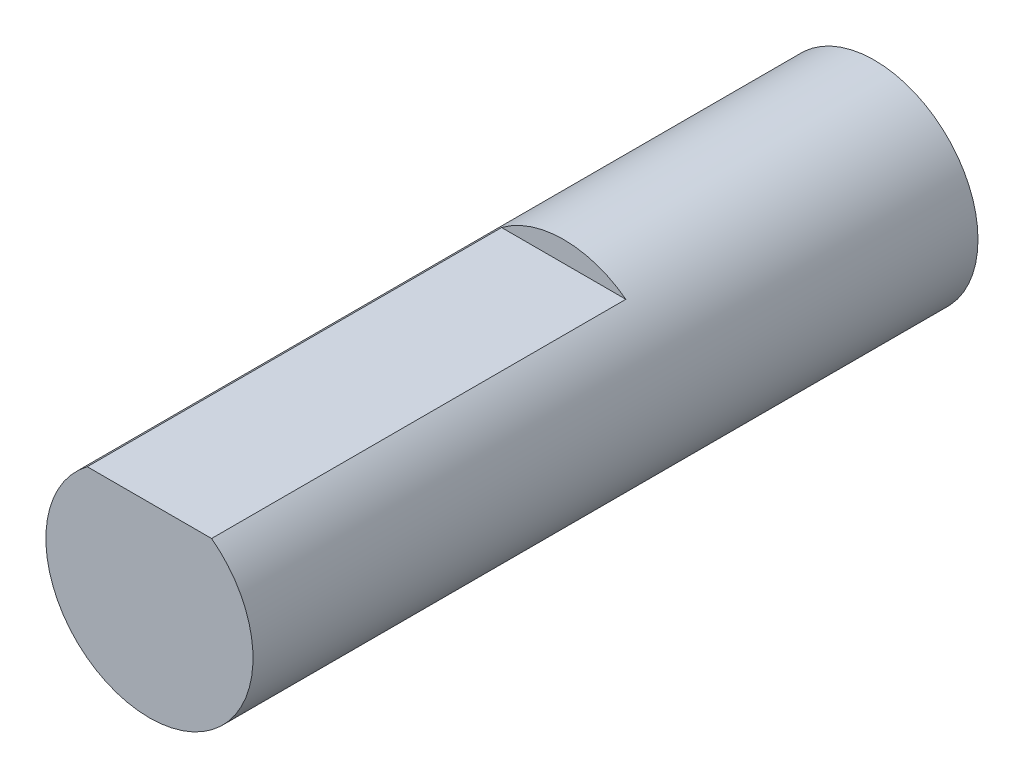
ISO-10303-21;
HEADER;
FILE_DESCRIPTION(('STEP AP214'),'2;1');
FILE_NAME('part.step','',(''),(''),'','','');
FILE_SCHEMA(('AUTOMOTIVE_DESIGN { 1 0 10303 214 1 1 1 1 }'));
ENDSEC;
DATA;
#1=APPLICATION_CONTEXT('core data for automotive mechanical design processes');
#2=APPLICATION_PROTOCOL_DEFINITION('international standard','automotive_design',2000,#1);
#3=PRODUCT_CONTEXT('',#1,'mechanical');
#4=PRODUCT('Part','Part','',(#3));
#5=PRODUCT_RELATED_PRODUCT_CATEGORY('part','',(#4));
#6=PRODUCT_DEFINITION_FORMATION('','',#4);
#7=PRODUCT_DEFINITION_CONTEXT('part definition',#1,'design');
#8=PRODUCT_DEFINITION('design','',#6,#7);
#9=PRODUCT_DEFINITION_SHAPE('','',#8);
#10=(LENGTH_UNIT() NAMED_UNIT(*) SI_UNIT(.MILLI.,.METRE.));
#11=(NAMED_UNIT(*) PLANE_ANGLE_UNIT() SI_UNIT($,.RADIAN.));
#12=(NAMED_UNIT(*) SI_UNIT($,.STERADIAN.) SOLID_ANGLE_UNIT());
#13=UNCERTAINTY_MEASURE_WITH_UNIT(LENGTH_MEASURE(1.E-05),#10,'distance_accuracy_value','');
#14=(GEOMETRIC_REPRESENTATION_CONTEXT(3) GLOBAL_UNCERTAINTY_ASSIGNED_CONTEXT((#13)) GLOBAL_UNIT_ASSIGNED_CONTEXT((#10,
#11,#12)) REPRESENTATION_CONTEXT('',''));
#15=CARTESIAN_POINT('',(0.,0.,0.));
#16=DIRECTION('',(0.,0.,1.));
#17=DIRECTION('',(1.,0.,0.));
#18=AXIS2_PLACEMENT_3D('',#15,#16,#17);
#19=CARTESIAN_POINT('',(0.,0.,14.));
#20=DIRECTION('',(0.,0.,-1.));
#21=DIRECTION('',(-1.,0.,0.));
#22=AXIS2_PLACEMENT_3D('',#19,#20,#21);
#23=CYLINDRICAL_SURFACE('',#22,2.);
#24=CARTESIAN_POINT('',(0.,0.,14.));
#25=DIRECTION('',(0.,0.,1.));
#26=DIRECTION('',(1.,0.,0.));
#27=AXIS2_PLACEMENT_3D('',#24,#25,#26);
#28=CIRCLE('',#27,2.);
#29=CARTESIAN_POINT('',(-1.2,1.6,14.));
#30=VERTEX_POINT('',#29);
#31=CARTESIAN_POINT('',(1.2,1.6,14.));
#32=VERTEX_POINT('',#31);
#33=EDGE_CURVE('E11',#30,#32,#28,.T.);
#34=ORIENTED_EDGE('',*,*,#33,.F.);
#35=DIRECTION('',(0.,0.,1.));
#36=VECTOR('',#35,1.);
#37=CARTESIAN_POINT('',(-1.2,1.6,6.));
#38=LINE('',#37,#36);
#39=CARTESIAN_POINT('',(-1.2,1.6,6.));
#40=VERTEX_POINT('',#39);
#41=EDGE_CURVE('E46',#40,#30,#38,.T.);
#42=ORIENTED_EDGE('',*,*,#41,.F.);
#43=CARTESIAN_POINT('',(0.,0.,6.));
#44=DIRECTION('',(0.,0.,1.));
#45=DIRECTION('',(-1.,0.,0.));
#46=AXIS2_PLACEMENT_3D('',#43,#44,#45);
#47=CIRCLE('',#46,2.00000000000001);
#48=CARTESIAN_POINT('',(1.2,1.6,6.));
#49=VERTEX_POINT('',#48);
#50=EDGE_CURVE('E61',#49,#40,#47,.T.);
#51=ORIENTED_EDGE('',*,*,#50,.F.);
#52=DIRECTION('',(0.,0.,1.));
#53=VECTOR('',#52,1.);
#54=CARTESIAN_POINT('',(1.2,1.6,6.));
#55=LINE('',#54,#53);
#56=EDGE_CURVE('E52',#49,#32,#55,.T.);
#57=ORIENTED_EDGE('',*,*,#56,.T.);
#58=EDGE_LOOP('',(#34,#42,#51,#57));
#59=FACE_BOUND('',#58,.T.);
#60=CARTESIAN_POINT('',(0.,0.,0.));
#61=DIRECTION('',(0.,0.,1.));
#62=DIRECTION('',(1.,0.,0.));
#63=AXIS2_PLACEMENT_3D('',#60,#61,#62);
#64=CIRCLE('',#63,2.);
#65=CARTESIAN_POINT('',(2.,0.,0.));
#66=VERTEX_POINT('',#65);
#67=EDGE_CURVE('E35',#66,#66,#64,.T.);
#68=ORIENTED_EDGE('',*,*,#67,.T.);
#69=EDGE_LOOP('',(#68));
#70=FACE_BOUND('',#69,.T.);
#71=ADVANCED_FACE('F32',(#59,#70),#23,.T.);
#72=CARTESIAN_POINT('',(0.,0.,14.));
#73=DIRECTION('',(0.,0.,1.));
#74=DIRECTION('',(1.,0.,0.));
#75=AXIS2_PLACEMENT_3D('',#72,#73,#74);
#76=PLANE('',#75);
#77=DIRECTION('',(1.,0.,0.));
#78=VECTOR('',#77,1.);
#79=CARTESIAN_POINT('',(-1.2,1.6,14.));
#80=LINE('',#79,#78);
#81=EDGE_CURVE('E57',#30,#32,#80,.T.);
#82=ORIENTED_EDGE('',*,*,#81,.F.);
#83=ORIENTED_EDGE('',*,*,#33,.T.);
#84=EDGE_LOOP('',(#82,#83));
#85=FACE_BOUND('',#84,.T.);
#86=ADVANCED_FACE('F67',(#85),#76,.T.);
#87=CARTESIAN_POINT('',(0.,0.,0.));
#88=DIRECTION('',(0.,0.,1.));
#89=DIRECTION('',(1.,0.,0.));
#90=AXIS2_PLACEMENT_3D('',#87,#88,#89);
#91=PLANE('',#90);
#92=ORIENTED_EDGE('',*,*,#67,.F.);
#93=EDGE_LOOP('',(#92));
#94=FACE_BOUND('',#93,.T.);
#95=ADVANCED_FACE('F69',(#94),#91,.F.);
#96=CARTESIAN_POINT('',(-1.2,1.6,6.));
#97=DIRECTION('',(0.,-1.,0.));
#98=DIRECTION('',(0.,0.,-1.));
#99=AXIS2_PLACEMENT_3D('',#96,#97,#98);
#100=PLANE('',#99);
#101=ORIENTED_EDGE('',*,*,#81,.T.);
#102=ORIENTED_EDGE('',*,*,#56,.F.);
#103=DIRECTION('',(1.,0.,0.));
#104=VECTOR('',#103,1.);
#105=CARTESIAN_POINT('',(-1.2,1.6,6.));
#106=LINE('',#105,#104);
#107=EDGE_CURVE('E84',#40,#49,#106,.T.);
#108=ORIENTED_EDGE('',*,*,#107,.F.);
#109=ORIENTED_EDGE('',*,*,#41,.T.);
#110=EDGE_LOOP('',(#101,#102,#108,#109));
#111=FACE_BOUND('',#110,.T.);
#112=ADVANCED_FACE('F58',(#111),#100,.F.);
#113=CARTESIAN_POINT('',(0.,0.,6.));
#114=DIRECTION('',(0.,0.,-1.));
#115=DIRECTION('',(-1.,0.,0.));
#116=AXIS2_PLACEMENT_3D('',#113,#114,#115);
#117=PLANE('',#116);
#118=ORIENTED_EDGE('',*,*,#50,.T.);
#119=ORIENTED_EDGE('',*,*,#107,.T.);
#120=EDGE_LOOP('',(#118,#119));
#121=FACE_BOUND('',#120,.T.);
#122=ADVANCED_FACE('F79',(#121),#117,.F.);
#123=CLOSED_SHELL('',(#71,#86,#95,#112,#122));
#124=MANIFOLD_SOLID_BREP('B2',#123);
#125=ADVANCED_BREP_SHAPE_REPRESENTATION('',(#18,#124),#14);
#126=SHAPE_DEFINITION_REPRESENTATION(#9,#125);
ENDSEC;
END-ISO-10303-21;
